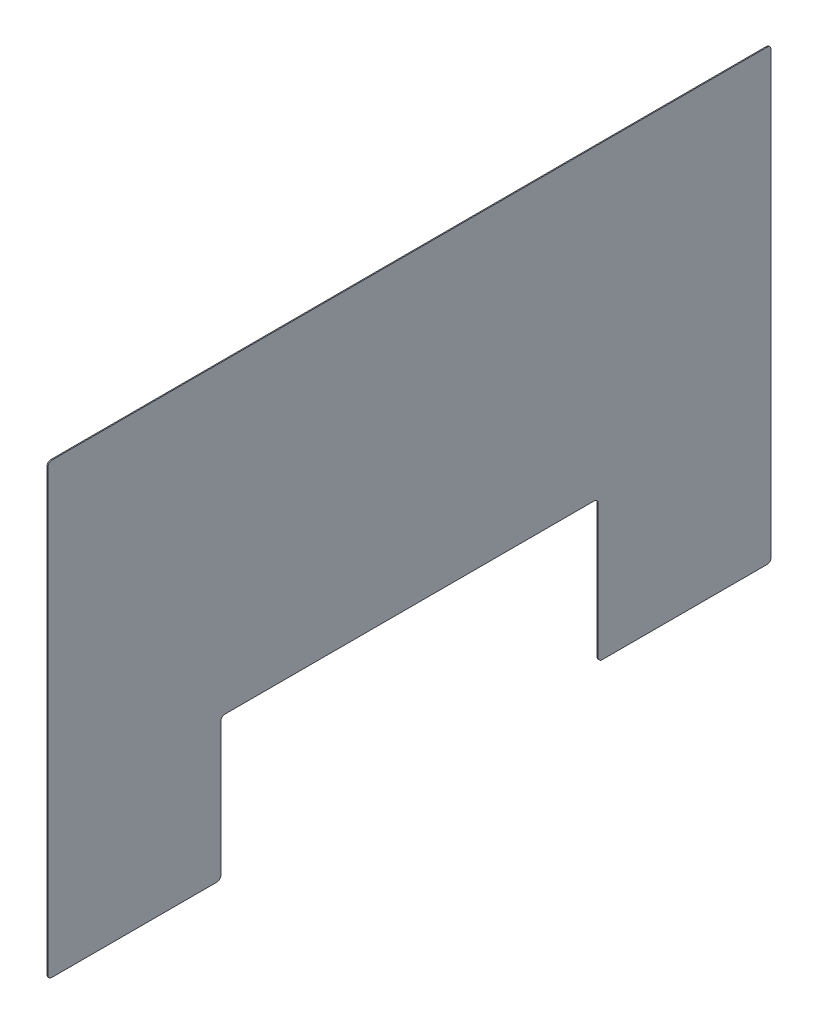
ISO-10303-21;
HEADER;
FILE_DESCRIPTION(('STEP AP214'),'2;1');
FILE_NAME('part.step','',(''),(''),'','','');
FILE_SCHEMA(('AUTOMOTIVE_DESIGN { 1 0 10303 214 1 1 1 1 }'));
ENDSEC;
DATA;
#1=APPLICATION_CONTEXT('core data for automotive mechanical design processes');
#2=APPLICATION_PROTOCOL_DEFINITION('international standard','automotive_design',2000,#1);
#3=PRODUCT_CONTEXT('',#1,'mechanical');
#4=PRODUCT('Part','Part','',(#3));
#5=PRODUCT_RELATED_PRODUCT_CATEGORY('part','',(#4));
#6=PRODUCT_DEFINITION_FORMATION('','',#4);
#7=PRODUCT_DEFINITION_CONTEXT('part definition',#1,'design');
#8=PRODUCT_DEFINITION('design','',#6,#7);
#9=PRODUCT_DEFINITION_SHAPE('','',#8);
#10=(LENGTH_UNIT() NAMED_UNIT(*) SI_UNIT(.MILLI.,.METRE.));
#11=(NAMED_UNIT(*) PLANE_ANGLE_UNIT() SI_UNIT($,.RADIAN.));
#12=(NAMED_UNIT(*) SI_UNIT($,.STERADIAN.) SOLID_ANGLE_UNIT());
#13=UNCERTAINTY_MEASURE_WITH_UNIT(LENGTH_MEASURE(1.E-05),#10,'distance_accuracy_value','');
#14=(GEOMETRIC_REPRESENTATION_CONTEXT(3) GLOBAL_UNCERTAINTY_ASSIGNED_CONTEXT((#13)) GLOBAL_UNIT_ASSIGNED_CONTEXT((#10,
#11,#12)) REPRESENTATION_CONTEXT('',''));
#15=CARTESIAN_POINT('',(0.,0.,0.));
#16=DIRECTION('',(0.,0.,1.));
#17=DIRECTION('',(1.,0.,0.));
#18=AXIS2_PLACEMENT_3D('',#15,#16,#17);
#19=CARTESIAN_POINT('',(1.5875,-361.95,584.2));
#20=DIRECTION('',(0.,0.,-1.));
#21=DIRECTION('',(-1.,0.,0.));
#22=AXIS2_PLACEMENT_3D('',#19,#20,#21);
#23=PLANE('',#22);
#24=DIRECTION('',(0.,-1.,0.));
#25=VECTOR('',#24,1.);
#26=CARTESIAN_POINT('',(0.,-361.95,584.2));
#27=LINE('',#26,#25);
#28=CARTESIAN_POINT('',(0.,355.6,584.2));
#29=VERTEX_POINT('',#28);
#30=CARTESIAN_POINT('',(0.,-355.6,584.2));
#31=VERTEX_POINT('',#30);
#32=EDGE_CURVE('E327',#29,#31,#27,.T.);
#33=ORIENTED_EDGE('',*,*,#32,.T.);
#34=DIRECTION('',(-1.,0.,0.));
#35=VECTOR('',#34,1.);
#36=CARTESIAN_POINT('',(1.5875,-355.6,584.2));
#37=LINE('',#36,#35);
#38=CARTESIAN_POINT('',(1.5875,-355.6,584.2));
#39=VERTEX_POINT('',#38);
#40=EDGE_CURVE('E270',#31,#39,#37,.F.);
#41=ORIENTED_EDGE('',*,*,#40,.T.);
#42=DIRECTION('',(0.,-1.,0.));
#43=VECTOR('',#42,1.);
#44=CARTESIAN_POINT('',(1.5875,-361.95,584.2));
#45=LINE('',#44,#43);
#46=CARTESIAN_POINT('',(1.5875,355.6,584.2));
#47=VERTEX_POINT('',#46);
#48=EDGE_CURVE('E182',#47,#39,#45,.T.);
#49=ORIENTED_EDGE('',*,*,#48,.F.);
#50=DIRECTION('',(-1.,0.,0.));
#51=VECTOR('',#50,1.);
#52=CARTESIAN_POINT('',(1.5875,355.6,584.2));
#53=LINE('',#52,#51);
#54=EDGE_CURVE('E266',#47,#29,#53,.T.);
#55=ORIENTED_EDGE('',*,*,#54,.T.);
#56=EDGE_LOOP('',(#33,#41,#49,#55));
#57=FACE_BOUND('',#56,.T.);
#58=ADVANCED_FACE('F38',(#57),#23,.F.);
#59=CARTESIAN_POINT('',(1.5875,-361.95,304.8));
#60=DIRECTION('',(0.,1.,0.));
#61=DIRECTION('',(0.,0.,1.));
#62=AXIS2_PLACEMENT_3D('',#59,#60,#61);
#63=PLANE('',#62);
#64=DIRECTION('',(0.,0.,-1.));
#65=VECTOR('',#64,1.);
#66=CARTESIAN_POINT('',(0.,-361.95,304.8));
#67=LINE('',#66,#65);
#68=CARTESIAN_POINT('',(0.,-361.95,577.85));
#69=VERTEX_POINT('',#68);
#70=CARTESIAN_POINT('',(0.,-361.95,311.15));
#71=VERTEX_POINT('',#70);
#72=EDGE_CURVE('E295',#69,#71,#67,.T.);
#73=ORIENTED_EDGE('',*,*,#72,.T.);
#74=DIRECTION('',(-1.,0.,0.));
#75=VECTOR('',#74,1.);
#76=CARTESIAN_POINT('',(1.5875,-361.95,311.15));
#77=LINE('',#76,#75);
#78=CARTESIAN_POINT('',(1.5875,-361.95,311.15));
#79=VERTEX_POINT('',#78);
#80=EDGE_CURVE('E263',#71,#79,#77,.F.);
#81=ORIENTED_EDGE('',*,*,#80,.T.);
#82=DIRECTION('',(0.,0.,-1.));
#83=VECTOR('',#82,1.);
#84=CARTESIAN_POINT('',(1.5875,-361.95,304.8));
#85=LINE('',#84,#83);
#86=CARTESIAN_POINT('',(1.5875,-361.95,577.85));
#87=VERTEX_POINT('',#86);
#88=EDGE_CURVE('E189',#87,#79,#85,.T.);
#89=ORIENTED_EDGE('',*,*,#88,.F.);
#90=DIRECTION('',(-1.,0.,0.));
#91=VECTOR('',#90,1.);
#92=CARTESIAN_POINT('',(1.5875,-361.95,577.85));
#93=LINE('',#92,#91);
#94=EDGE_CURVE('E259',#87,#69,#93,.T.);
#95=ORIENTED_EDGE('',*,*,#94,.T.);
#96=EDGE_LOOP('',(#73,#81,#89,#95));
#97=FACE_BOUND('',#96,.T.);
#98=ADVANCED_FACE('F361',(#97),#63,.F.);
#99=CARTESIAN_POINT('',(1.5875,-133.35,304.8));
#100=DIRECTION('',(0.,0.,1.));
#101=DIRECTION('',(0.,-1.,0.));
#102=AXIS2_PLACEMENT_3D('',#99,#100,#101);
#103=PLANE('',#102);
#104=DIRECTION('',(0.,1.,0.));
#105=VECTOR('',#104,1.);
#106=CARTESIAN_POINT('',(0.,-133.35,304.8));
#107=LINE('',#106,#105);
#108=CARTESIAN_POINT('',(0.,-355.6,304.8));
#109=VERTEX_POINT('',#108);
#110=CARTESIAN_POINT('',(0.,-139.7,304.8));
#111=VERTEX_POINT('',#110);
#112=EDGE_CURVE('E283',#109,#111,#107,.T.);
#113=ORIENTED_EDGE('',*,*,#112,.T.);
#114=DIRECTION('',(-1.,0.,0.));
#115=VECTOR('',#114,1.);
#116=CARTESIAN_POINT('',(1.5875,-139.7,304.8));
#117=LINE('',#116,#115);
#118=CARTESIAN_POINT('',(1.5875,-139.7,304.8));
#119=VERTEX_POINT('',#118);
#120=EDGE_CURVE('E256',#111,#119,#117,.F.);
#121=ORIENTED_EDGE('',*,*,#120,.T.);
#122=DIRECTION('',(0.,1.,0.));
#123=VECTOR('',#122,1.);
#124=CARTESIAN_POINT('',(1.5875,-133.35,304.8));
#125=LINE('',#124,#123);
#126=CARTESIAN_POINT('',(1.5875,-355.6,304.8));
#127=VERTEX_POINT('',#126);
#128=EDGE_CURVE('E305',#127,#119,#125,.T.);
#129=ORIENTED_EDGE('',*,*,#128,.F.);
#130=DIRECTION('',(-1.,0.,0.));
#131=VECTOR('',#130,1.);
#132=CARTESIAN_POINT('',(1.5875,-355.6,304.8));
#133=LINE('',#132,#131);
#134=EDGE_CURVE('E252',#127,#109,#133,.T.);
#135=ORIENTED_EDGE('',*,*,#134,.T.);
#136=EDGE_LOOP('',(#113,#121,#129,#135));
#137=FACE_BOUND('',#136,.T.);
#138=ADVANCED_FACE('F290',(#137),#103,.F.);
#139=CARTESIAN_POINT('',(1.5875,-133.35,-304.8));
#140=DIRECTION('',(0.,1.,0.));
#141=DIRECTION('',(0.,0.,1.));
#142=AXIS2_PLACEMENT_3D('',#139,#140,#141);
#143=PLANE('',#142);
#144=DIRECTION('',(0.,0.,-1.));
#145=VECTOR('',#144,1.);
#146=CARTESIAN_POINT('',(0.,-133.35,-304.8));
#147=LINE('',#146,#145);
#148=CARTESIAN_POINT('',(0.,-133.35,298.45));
#149=VERTEX_POINT('',#148);
#150=CARTESIAN_POINT('',(0.,-133.35,-298.45));
#151=VERTEX_POINT('',#150);
#152=EDGE_CURVE('E285',#149,#151,#147,.T.);
#153=ORIENTED_EDGE('',*,*,#152,.T.);
#154=DIRECTION('',(-1.,0.,0.));
#155=VECTOR('',#154,1.);
#156=CARTESIAN_POINT('',(1.5875,-133.35,-298.45));
#157=LINE('',#156,#155);
#158=CARTESIAN_POINT('',(1.5875,-133.35,-298.45));
#159=VERTEX_POINT('',#158);
#160=EDGE_CURVE('E249',#151,#159,#157,.F.);
#161=ORIENTED_EDGE('',*,*,#160,.T.);
#162=DIRECTION('',(0.,0.,-1.));
#163=VECTOR('',#162,1.);
#164=CARTESIAN_POINT('',(1.5875,-133.35,-304.8));
#165=LINE('',#164,#163);
#166=CARTESIAN_POINT('',(1.5875,-133.35,298.45));
#167=VERTEX_POINT('',#166);
#168=EDGE_CURVE('E303',#167,#159,#165,.T.);
#169=ORIENTED_EDGE('',*,*,#168,.F.);
#170=DIRECTION('',(-1.,0.,0.));
#171=VECTOR('',#170,1.);
#172=CARTESIAN_POINT('',(0.,-133.35,298.45));
#173=LINE('',#172,#171);
#174=EDGE_CURVE('E245',#167,#149,#173,.T.);
#175=ORIENTED_EDGE('',*,*,#174,.T.);
#176=EDGE_LOOP('',(#153,#161,#169,#175));
#177=FACE_BOUND('',#176,.T.);
#178=ADVANCED_FACE('F307',(#177),#143,.F.);
#179=CARTESIAN_POINT('',(1.5875,-133.35,-304.8));
#180=DIRECTION('',(0.,0.,-1.));
#181=DIRECTION('',(0.,1.,0.));
#182=AXIS2_PLACEMENT_3D('',#179,#180,#181);
#183=PLANE('',#182);
#184=DIRECTION('',(0.,-1.,0.));
#185=VECTOR('',#184,1.);
#186=CARTESIAN_POINT('',(0.,-133.35,-304.8));
#187=LINE('',#186,#185);
#188=CARTESIAN_POINT('',(0.,-139.7,-304.8));
#189=VERTEX_POINT('',#188);
#190=CARTESIAN_POINT('',(0.,-355.6,-304.8));
#191=VERTEX_POINT('',#190);
#192=EDGE_CURVE('E336',#189,#191,#187,.T.);
#193=ORIENTED_EDGE('',*,*,#192,.T.);
#194=DIRECTION('',(-1.,0.,0.));
#195=VECTOR('',#194,1.);
#196=CARTESIAN_POINT('',(1.5875,-355.6,-304.8));
#197=LINE('',#196,#195);
#198=CARTESIAN_POINT('',(1.5875,-355.6,-304.8));
#199=VERTEX_POINT('',#198);
#200=EDGE_CURVE('E242',#191,#199,#197,.F.);
#201=ORIENTED_EDGE('',*,*,#200,.T.);
#202=DIRECTION('',(0.,-1.,0.));
#203=VECTOR('',#202,1.);
#204=CARTESIAN_POINT('',(1.5875,-133.35,-304.8));
#205=LINE('',#204,#203);
#206=CARTESIAN_POINT('',(1.5875,-139.7,-304.8));
#207=VERTEX_POINT('',#206);
#208=EDGE_CURVE('E310',#207,#199,#205,.T.);
#209=ORIENTED_EDGE('',*,*,#208,.F.);
#210=DIRECTION('',(-1.,0.,0.));
#211=VECTOR('',#210,1.);
#212=CARTESIAN_POINT('',(0.,-139.7,-304.8));
#213=LINE('',#212,#211);
#214=EDGE_CURVE('E238',#207,#189,#213,.T.);
#215=ORIENTED_EDGE('',*,*,#214,.T.);
#216=EDGE_LOOP('',(#193,#201,#209,#215));
#217=FACE_BOUND('',#216,.T.);
#218=ADVANCED_FACE('F358',(#217),#183,.F.);
#219=CARTESIAN_POINT('',(1.5875,-361.95,-584.2));
#220=DIRECTION('',(0.,1.,0.));
#221=DIRECTION('',(0.,0.,1.));
#222=AXIS2_PLACEMENT_3D('',#219,#220,#221);
#223=PLANE('',#222);
#224=DIRECTION('',(0.,0.,-1.));
#225=VECTOR('',#224,1.);
#226=CARTESIAN_POINT('',(0.,-361.95,-584.2));
#227=LINE('',#226,#225);
#228=CARTESIAN_POINT('',(0.,-361.95,-311.15));
#229=VERTEX_POINT('',#228);
#230=CARTESIAN_POINT('',(0.,-361.95,-577.85));
#231=VERTEX_POINT('',#230);
#232=EDGE_CURVE('E191',#229,#231,#227,.T.);
#233=ORIENTED_EDGE('',*,*,#232,.T.);
#234=DIRECTION('',(-1.,0.,0.));
#235=VECTOR('',#234,1.);
#236=CARTESIAN_POINT('',(1.5875,-361.95,-577.85));
#237=LINE('',#236,#235);
#238=CARTESIAN_POINT('',(1.5875,-361.95,-577.85));
#239=VERTEX_POINT('',#238);
#240=EDGE_CURVE('E54',#231,#239,#237,.F.);
#241=ORIENTED_EDGE('',*,*,#240,.T.);
#242=DIRECTION('',(0.,0.,-1.));
#243=VECTOR('',#242,1.);
#244=CARTESIAN_POINT('',(1.5875,-361.95,-584.2));
#245=LINE('',#244,#243);
#246=CARTESIAN_POINT('',(1.5875,-361.95,-311.15));
#247=VERTEX_POINT('',#246);
#248=EDGE_CURVE('E315',#247,#239,#245,.T.);
#249=ORIENTED_EDGE('',*,*,#248,.F.);
#250=DIRECTION('',(-1.,0.,0.));
#251=VECTOR('',#250,1.);
#252=CARTESIAN_POINT('',(1.5875,-361.95,-311.15));
#253=LINE('',#252,#251);
#254=EDGE_CURVE('E232',#247,#229,#253,.T.);
#255=ORIENTED_EDGE('',*,*,#254,.T.);
#256=EDGE_LOOP('',(#233,#241,#249,#255));
#257=FACE_BOUND('',#256,.T.);
#258=ADVANCED_FACE('F342',(#257),#223,.F.);
#259=CARTESIAN_POINT('',(1.5875,-361.95,-584.2));
#260=DIRECTION('',(0.,0.,1.));
#261=DIRECTION('',(0.,-1.,0.));
#262=AXIS2_PLACEMENT_3D('',#259,#260,#261);
#263=PLANE('',#262);
#264=DIRECTION('',(0.,1.,0.));
#265=VECTOR('',#264,1.);
#266=CARTESIAN_POINT('',(0.,-361.95,-584.2));
#267=LINE('',#266,#265);
#268=CARTESIAN_POINT('',(0.,-355.6,-584.2));
#269=VERTEX_POINT('',#268);
#270=CARTESIAN_POINT('',(0.,355.6,-584.2));
#271=VERTEX_POINT('',#270);
#272=EDGE_CURVE('E183',#269,#271,#267,.T.);
#273=ORIENTED_EDGE('',*,*,#272,.T.);
#274=DIRECTION('',(-1.,0.,0.));
#275=VECTOR('',#274,1.);
#276=CARTESIAN_POINT('',(1.5875,355.6,-584.2));
#277=LINE('',#276,#275);
#278=CARTESIAN_POINT('',(1.5875,355.6,-584.2));
#279=VERTEX_POINT('',#278);
#280=EDGE_CURVE('E158',#271,#279,#277,.F.);
#281=ORIENTED_EDGE('',*,*,#280,.T.);
#282=DIRECTION('',(0.,1.,0.));
#283=VECTOR('',#282,1.);
#284=CARTESIAN_POINT('',(1.5875,-361.95,-584.2));
#285=LINE('',#284,#283);
#286=CARTESIAN_POINT('',(1.5875,-355.6,-584.2));
#287=VERTEX_POINT('',#286);
#288=EDGE_CURVE('E322',#287,#279,#285,.T.);
#289=ORIENTED_EDGE('',*,*,#288,.F.);
#290=DIRECTION('',(-1.,0.,0.));
#291=VECTOR('',#290,1.);
#292=CARTESIAN_POINT('',(1.5875,-355.6,-584.2));
#293=LINE('',#292,#291);
#294=EDGE_CURVE('E164',#287,#269,#293,.T.);
#295=ORIENTED_EDGE('',*,*,#294,.T.);
#296=EDGE_LOOP('',(#273,#281,#289,#295));
#297=FACE_BOUND('',#296,.T.);
#298=ADVANCED_FACE('F350',(#297),#263,.F.);
#299=CARTESIAN_POINT('',(1.5875,361.95,-584.2));
#300=DIRECTION('',(0.,-1.,0.));
#301=DIRECTION('',(0.,0.,-1.));
#302=AXIS2_PLACEMENT_3D('',#299,#300,#301);
#303=PLANE('',#302);
#304=DIRECTION('',(0.,0.,1.));
#305=VECTOR('',#304,1.);
#306=CARTESIAN_POINT('',(1.5875,361.95,-584.2));
#307=LINE('',#306,#305);
#308=CARTESIAN_POINT('',(1.5875,361.95,-577.85));
#309=VERTEX_POINT('',#308);
#310=CARTESIAN_POINT('',(1.5875,361.95,577.85));
#311=VERTEX_POINT('',#310);
#312=EDGE_CURVE('E174',#309,#311,#307,.T.);
#313=ORIENTED_EDGE('',*,*,#312,.F.);
#314=DIRECTION('',(-1.,0.,0.));
#315=VECTOR('',#314,1.);
#316=CARTESIAN_POINT('',(1.5875,361.95,-577.85));
#317=LINE('',#316,#315);
#318=CARTESIAN_POINT('',(0.,361.95,-577.85));
#319=VERTEX_POINT('',#318);
#320=EDGE_CURVE('E157',#309,#319,#317,.T.);
#321=ORIENTED_EDGE('',*,*,#320,.T.);
#322=DIRECTION('',(0.,0.,1.));
#323=VECTOR('',#322,1.);
#324=CARTESIAN_POINT('',(0.,361.95,-584.2));
#325=LINE('',#324,#323);
#326=CARTESIAN_POINT('',(0.,361.95,577.85));
#327=VERTEX_POINT('',#326);
#328=EDGE_CURVE('E171',#319,#327,#325,.T.);
#329=ORIENTED_EDGE('',*,*,#328,.T.);
#330=DIRECTION('',(-1.,0.,0.));
#331=VECTOR('',#330,1.);
#332=CARTESIAN_POINT('',(1.5875,361.95,577.85));
#333=LINE('',#332,#331);
#334=EDGE_CURVE('E177',#327,#311,#333,.F.);
#335=ORIENTED_EDGE('',*,*,#334,.T.);
#336=EDGE_LOOP('',(#313,#321,#329,#335));
#337=FACE_BOUND('',#336,.T.);
#338=ADVANCED_FACE('F170',(#337),#303,.F.);
#339=CARTESIAN_POINT('',(1.5875,0.,0.));
#340=DIRECTION('',(1.,0.,0.));
#341=DIRECTION('',(0.,0.,-1.));
#342=AXIS2_PLACEMENT_3D('',#339,#340,#341);
#343=PLANE('',#342);
#344=ORIENTED_EDGE('',*,*,#288,.T.);
#345=CARTESIAN_POINT('',(1.5875,355.6,-577.85));
#346=DIRECTION('',(1.,0.,0.));
#347=DIRECTION('',(0.,0.,-1.));
#348=AXIS2_PLACEMENT_3D('',#345,#346,#347);
#349=CIRCLE('',#348,6.35);
#350=EDGE_CURVE('E229',#279,#309,#349,.T.);
#351=ORIENTED_EDGE('',*,*,#350,.T.);
#352=ORIENTED_EDGE('',*,*,#312,.T.);
#353=CARTESIAN_POINT('',(1.5875,355.6,577.85));
#354=DIRECTION('',(1.,0.,0.));
#355=DIRECTION('',(0.,0.,-1.));
#356=AXIS2_PLACEMENT_3D('',#353,#354,#355);
#357=CIRCLE('',#356,6.35);
#358=EDGE_CURVE('E215',#311,#47,#357,.T.);
#359=ORIENTED_EDGE('',*,*,#358,.T.);
#360=ORIENTED_EDGE('',*,*,#48,.T.);
#361=CARTESIAN_POINT('',(1.5875,-355.6,577.85));
#362=DIRECTION('',(1.,0.,0.));
#363=DIRECTION('',(0.,0.,-1.));
#364=AXIS2_PLACEMENT_3D('',#361,#362,#363);
#365=CIRCLE('',#364,6.35);
#366=EDGE_CURVE('E218',#39,#87,#365,.T.);
#367=ORIENTED_EDGE('',*,*,#366,.T.);
#368=ORIENTED_EDGE('',*,*,#88,.T.);
#369=CARTESIAN_POINT('',(1.5875,-355.6,311.15));
#370=DIRECTION('',(1.,0.,0.));
#371=DIRECTION('',(0.,0.,-1.));
#372=AXIS2_PLACEMENT_3D('',#369,#370,#371);
#373=CIRCLE('',#372,6.35);
#374=EDGE_CURVE('E221',#79,#127,#373,.T.);
#375=ORIENTED_EDGE('',*,*,#374,.T.);
#376=ORIENTED_EDGE('',*,*,#128,.T.);
#377=CARTESIAN_POINT('',(1.5875,-139.7,298.45));
#378=DIRECTION('',(1.,0.,0.));
#379=DIRECTION('',(0.,0.,-1.));
#380=AXIS2_PLACEMENT_3D('',#377,#378,#379);
#381=CIRCLE('',#380,6.35);
#382=EDGE_CURVE('E11',#119,#167,#381,.F.);
#383=ORIENTED_EDGE('',*,*,#382,.T.);
#384=ORIENTED_EDGE('',*,*,#168,.T.);
#385=CARTESIAN_POINT('',(1.5875,-139.7,-298.45));
#386=DIRECTION('',(1.,0.,0.));
#387=DIRECTION('',(0.,0.,-1.));
#388=AXIS2_PLACEMENT_3D('',#385,#386,#387);
#389=CIRCLE('',#388,6.35);
#390=EDGE_CURVE('E276',#159,#207,#389,.F.);
#391=ORIENTED_EDGE('',*,*,#390,.T.);
#392=ORIENTED_EDGE('',*,*,#208,.T.);
#393=CARTESIAN_POINT('',(1.5875,-355.6,-311.15));
#394=DIRECTION('',(1.,0.,0.));
#395=DIRECTION('',(0.,0.,-1.));
#396=AXIS2_PLACEMENT_3D('',#393,#394,#395);
#397=CIRCLE('',#396,6.35);
#398=EDGE_CURVE('E61',#199,#247,#397,.T.);
#399=ORIENTED_EDGE('',*,*,#398,.T.);
#400=ORIENTED_EDGE('',*,*,#248,.T.);
#401=CARTESIAN_POINT('',(1.5875,-355.6,-577.85));
#402=DIRECTION('',(1.,0.,0.));
#403=DIRECTION('',(0.,0.,-1.));
#404=AXIS2_PLACEMENT_3D('',#401,#402,#403);
#405=CIRCLE('',#404,6.35);
#406=EDGE_CURVE('E226',#239,#287,#405,.T.);
#407=ORIENTED_EDGE('',*,*,#406,.T.);
#408=EDGE_LOOP('',(#344,#351,#352,#359,#360,#367,#368,#375,#376,#383,#384,#391,#392,#399,#400,#407));
#409=FACE_BOUND('',#408,.T.);
#410=ADVANCED_FACE('F302',(#409),#343,.T.);
#411=CARTESIAN_POINT('',(0.,0.,0.));
#412=DIRECTION('',(1.,0.,0.));
#413=DIRECTION('',(0.,0.,-1.));
#414=AXIS2_PLACEMENT_3D('',#411,#412,#413);
#415=PLANE('',#414);
#416=ORIENTED_EDGE('',*,*,#328,.F.);
#417=CARTESIAN_POINT('',(0.,355.6,-577.85));
#418=DIRECTION('',(1.,0.,0.));
#419=DIRECTION('',(0.,0.,-1.));
#420=AXIS2_PLACEMENT_3D('',#417,#418,#419);
#421=CIRCLE('',#420,6.35);
#422=EDGE_CURVE('E153',#319,#271,#421,.F.);
#423=ORIENTED_EDGE('',*,*,#422,.T.);
#424=ORIENTED_EDGE('',*,*,#272,.F.);
#425=CARTESIAN_POINT('',(0.,-355.6,-577.85));
#426=DIRECTION('',(1.,0.,0.));
#427=DIRECTION('',(0.,0.,-1.));
#428=AXIS2_PLACEMENT_3D('',#425,#426,#427);
#429=CIRCLE('',#428,6.35);
#430=EDGE_CURVE('E165',#269,#231,#429,.F.);
#431=ORIENTED_EDGE('',*,*,#430,.T.);
#432=ORIENTED_EDGE('',*,*,#232,.F.);
#433=CARTESIAN_POINT('',(0.,-355.6,-311.15));
#434=DIRECTION('',(1.,0.,0.));
#435=DIRECTION('',(0.,0.,-1.));
#436=AXIS2_PLACEMENT_3D('',#433,#434,#435);
#437=CIRCLE('',#436,6.35);
#438=EDGE_CURVE('E205',#229,#191,#437,.F.);
#439=ORIENTED_EDGE('',*,*,#438,.T.);
#440=ORIENTED_EDGE('',*,*,#192,.F.);
#441=CARTESIAN_POINT('',(0.,-139.7,-298.45));
#442=DIRECTION('',(1.,0.,0.));
#443=DIRECTION('',(0.,0.,-1.));
#444=AXIS2_PLACEMENT_3D('',#441,#442,#443);
#445=CIRCLE('',#444,6.35);
#446=EDGE_CURVE('E273',#189,#151,#445,.T.);
#447=ORIENTED_EDGE('',*,*,#446,.T.);
#448=ORIENTED_EDGE('',*,*,#152,.F.);
#449=CARTESIAN_POINT('',(0.,-139.7,298.45));
#450=DIRECTION('',(1.,0.,0.));
#451=DIRECTION('',(0.,0.,-1.));
#452=AXIS2_PLACEMENT_3D('',#449,#450,#451);
#453=CIRCLE('',#452,6.35);
#454=EDGE_CURVE('E47',#149,#111,#453,.T.);
#455=ORIENTED_EDGE('',*,*,#454,.T.);
#456=ORIENTED_EDGE('',*,*,#112,.F.);
#457=CARTESIAN_POINT('',(0.,-355.6,311.15));
#458=DIRECTION('',(1.,0.,0.));
#459=DIRECTION('',(0.,0.,-1.));
#460=AXIS2_PLACEMENT_3D('',#457,#458,#459);
#461=CIRCLE('',#460,6.35);
#462=EDGE_CURVE('E202',#109,#71,#461,.F.);
#463=ORIENTED_EDGE('',*,*,#462,.T.);
#464=ORIENTED_EDGE('',*,*,#72,.F.);
#465=CARTESIAN_POINT('',(0.,-355.6,577.85));
#466=DIRECTION('',(1.,0.,0.));
#467=DIRECTION('',(0.,0.,-1.));
#468=AXIS2_PLACEMENT_3D('',#465,#466,#467);
#469=CIRCLE('',#468,6.35);
#470=EDGE_CURVE('E199',#69,#31,#469,.F.);
#471=ORIENTED_EDGE('',*,*,#470,.T.);
#472=ORIENTED_EDGE('',*,*,#32,.F.);
#473=CARTESIAN_POINT('',(0.,355.6,577.85));
#474=DIRECTION('',(1.,0.,0.));
#475=DIRECTION('',(0.,0.,-1.));
#476=AXIS2_PLACEMENT_3D('',#473,#474,#475);
#477=CIRCLE('',#476,6.35);
#478=EDGE_CURVE('E176',#29,#327,#477,.F.);
#479=ORIENTED_EDGE('',*,*,#478,.T.);
#480=EDGE_LOOP('',(#416,#423,#424,#431,#432,#439,#440,#447,#448,#455,#456,#463,#464,#471,#472,#479));
#481=FACE_BOUND('',#480,.T.);
#482=ADVANCED_FACE('F179',(#481),#415,.F.);
#483=CARTESIAN_POINT('',(1.5875,355.6,-577.85));
#484=DIRECTION('',(-1.,0.,0.));
#485=DIRECTION('',(0.,0.,1.));
#486=AXIS2_PLACEMENT_3D('',#483,#484,#485);
#487=CYLINDRICAL_SURFACE('',#486,6.35);
#488=ORIENTED_EDGE('',*,*,#350,.F.);
#489=ORIENTED_EDGE('',*,*,#280,.F.);
#490=ORIENTED_EDGE('',*,*,#422,.F.);
#491=ORIENTED_EDGE('',*,*,#320,.F.);
#492=EDGE_LOOP('',(#488,#489,#490,#491));
#493=FACE_BOUND('',#492,.T.);
#494=ADVANCED_FACE('F156',(#493),#487,.T.);
#495=CARTESIAN_POINT('',(1.5875,-355.6,-577.85));
#496=DIRECTION('',(-1.,0.,0.));
#497=DIRECTION('',(0.,0.,1.));
#498=AXIS2_PLACEMENT_3D('',#495,#496,#497);
#499=CYLINDRICAL_SURFACE('',#498,6.35);
#500=ORIENTED_EDGE('',*,*,#406,.F.);
#501=ORIENTED_EDGE('',*,*,#240,.F.);
#502=ORIENTED_EDGE('',*,*,#430,.F.);
#503=ORIENTED_EDGE('',*,*,#294,.F.);
#504=EDGE_LOOP('',(#500,#501,#502,#503));
#505=FACE_BOUND('',#504,.T.);
#506=ADVANCED_FACE('F346',(#505),#499,.T.);
#507=CARTESIAN_POINT('',(1.5875,-355.6,-311.15));
#508=DIRECTION('',(-1.,0.,0.));
#509=DIRECTION('',(0.,0.,1.));
#510=AXIS2_PLACEMENT_3D('',#507,#508,#509);
#511=CYLINDRICAL_SURFACE('',#510,6.35);
#512=ORIENTED_EDGE('',*,*,#398,.F.);
#513=ORIENTED_EDGE('',*,*,#200,.F.);
#514=ORIENTED_EDGE('',*,*,#438,.F.);
#515=ORIENTED_EDGE('',*,*,#254,.F.);
#516=EDGE_LOOP('',(#512,#513,#514,#515));
#517=FACE_BOUND('',#516,.T.);
#518=ADVANCED_FACE('F375',(#517),#511,.T.);
#519=CARTESIAN_POINT('',(1.5875,-139.7,-298.45));
#520=DIRECTION('',(1.,0.,0.));
#521=DIRECTION('',(0.,0.,-1.));
#522=AXIS2_PLACEMENT_3D('',#519,#520,#521);
#523=CYLINDRICAL_SURFACE('',#522,6.35);
#524=ORIENTED_EDGE('',*,*,#390,.F.);
#525=ORIENTED_EDGE('',*,*,#160,.F.);
#526=ORIENTED_EDGE('',*,*,#446,.F.);
#527=ORIENTED_EDGE('',*,*,#214,.F.);
#528=EDGE_LOOP('',(#524,#525,#526,#527));
#529=FACE_BOUND('',#528,.T.);
#530=ADVANCED_FACE('F378',(#529),#523,.F.);
#531=CARTESIAN_POINT('',(1.5875,-139.7,298.45));
#532=DIRECTION('',(1.,0.,0.));
#533=DIRECTION('',(0.,0.,-1.));
#534=AXIS2_PLACEMENT_3D('',#531,#532,#533);
#535=CYLINDRICAL_SURFACE('',#534,6.35);
#536=ORIENTED_EDGE('',*,*,#382,.F.);
#537=ORIENTED_EDGE('',*,*,#120,.F.);
#538=ORIENTED_EDGE('',*,*,#454,.F.);
#539=ORIENTED_EDGE('',*,*,#174,.F.);
#540=EDGE_LOOP('',(#536,#537,#538,#539));
#541=FACE_BOUND('',#540,.T.);
#542=ADVANCED_FACE('F298',(#541),#535,.F.);
#543=CARTESIAN_POINT('',(1.5875,-355.6,311.15));
#544=DIRECTION('',(-1.,0.,0.));
#545=DIRECTION('',(0.,0.,1.));
#546=AXIS2_PLACEMENT_3D('',#543,#544,#545);
#547=CYLINDRICAL_SURFACE('',#546,6.35);
#548=ORIENTED_EDGE('',*,*,#374,.F.);
#549=ORIENTED_EDGE('',*,*,#80,.F.);
#550=ORIENTED_EDGE('',*,*,#462,.F.);
#551=ORIENTED_EDGE('',*,*,#134,.F.);
#552=EDGE_LOOP('',(#548,#549,#550,#551));
#553=FACE_BOUND('',#552,.T.);
#554=ADVANCED_FACE('F385',(#553),#547,.T.);
#555=CARTESIAN_POINT('',(1.5875,-355.6,577.85));
#556=DIRECTION('',(-1.,0.,0.));
#557=DIRECTION('',(0.,0.,1.));
#558=AXIS2_PLACEMENT_3D('',#555,#556,#557);
#559=CYLINDRICAL_SURFACE('',#558,6.35);
#560=ORIENTED_EDGE('',*,*,#366,.F.);
#561=ORIENTED_EDGE('',*,*,#40,.F.);
#562=ORIENTED_EDGE('',*,*,#470,.F.);
#563=ORIENTED_EDGE('',*,*,#94,.F.);
#564=EDGE_LOOP('',(#560,#561,#562,#563));
#565=FACE_BOUND('',#564,.T.);
#566=ADVANCED_FACE('F387',(#565),#559,.T.);
#567=CARTESIAN_POINT('',(1.5875,355.6,577.85));
#568=DIRECTION('',(-1.,0.,0.));
#569=DIRECTION('',(0.,0.,1.));
#570=AXIS2_PLACEMENT_3D('',#567,#568,#569);
#571=CYLINDRICAL_SURFACE('',#570,6.35);
#572=ORIENTED_EDGE('',*,*,#358,.F.);
#573=ORIENTED_EDGE('',*,*,#334,.F.);
#574=ORIENTED_EDGE('',*,*,#478,.F.);
#575=ORIENTED_EDGE('',*,*,#54,.F.);
#576=EDGE_LOOP('',(#572,#573,#574,#575));
#577=FACE_BOUND('',#576,.T.);
#578=ADVANCED_FACE('F40',(#577),#571,.T.);
#579=CLOSED_SHELL('',(#58,#98,#138,#178,#218,#258,#298,#338,#410,#482,#494,#506,#518,#530,#542,
#554,#566,#578));
#580=MANIFOLD_SOLID_BREP('B2',#579);
#581=ADVANCED_BREP_SHAPE_REPRESENTATION('',(#18,#580),#14);
#582=SHAPE_DEFINITION_REPRESENTATION(#9,#581);
ENDSEC;
END-ISO-10303-21;
